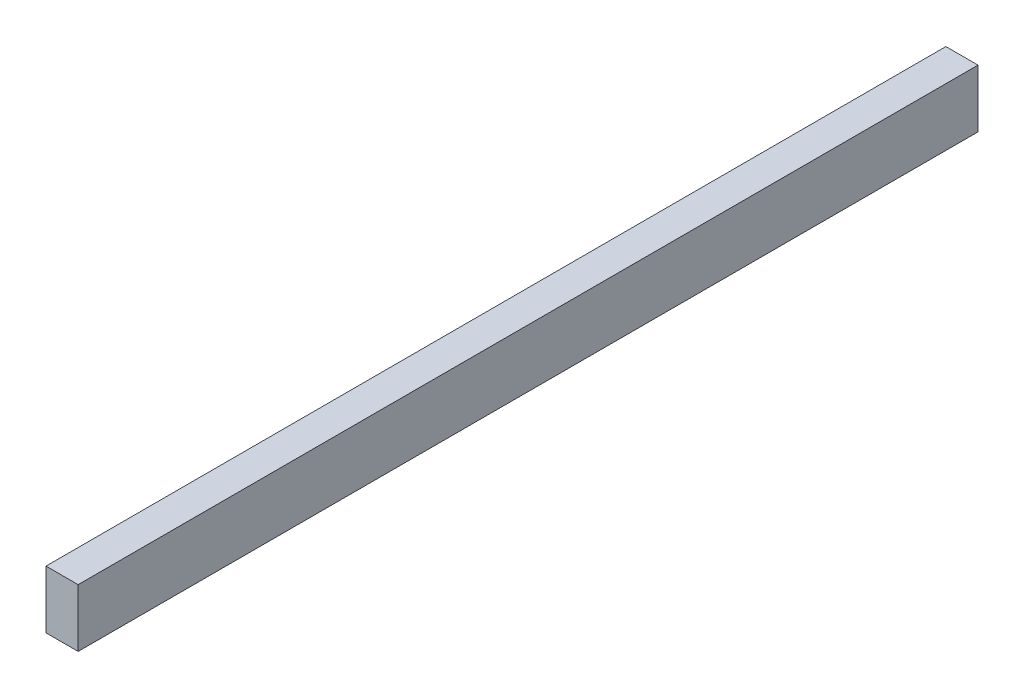
ISO-10303-21;
HEADER;
FILE_DESCRIPTION(('STEP AP214'),'2;1');
FILE_NAME('part.step','',(''),(''),'','','');
FILE_SCHEMA(('AUTOMOTIVE_DESIGN { 1 0 10303 214 1 1 1 1 }'));
ENDSEC;
DATA;
#1=APPLICATION_CONTEXT('core data for automotive mechanical design processes');
#2=APPLICATION_PROTOCOL_DEFINITION('international standard','automotive_design',2000,#1);
#3=PRODUCT_CONTEXT('',#1,'mechanical');
#4=PRODUCT('Part','Part','',(#3));
#5=PRODUCT_RELATED_PRODUCT_CATEGORY('part','',(#4));
#6=PRODUCT_DEFINITION_FORMATION('','',#4);
#7=PRODUCT_DEFINITION_CONTEXT('part definition',#1,'design');
#8=PRODUCT_DEFINITION('design','',#6,#7);
#9=PRODUCT_DEFINITION_SHAPE('','',#8);
#10=(LENGTH_UNIT() NAMED_UNIT(*) SI_UNIT(.MILLI.,.METRE.));
#11=(NAMED_UNIT(*) PLANE_ANGLE_UNIT() SI_UNIT($,.RADIAN.));
#12=(NAMED_UNIT(*) SI_UNIT($,.STERADIAN.) SOLID_ANGLE_UNIT());
#13=UNCERTAINTY_MEASURE_WITH_UNIT(LENGTH_MEASURE(1.E-05),#10,'distance_accuracy_value','');
#14=(GEOMETRIC_REPRESENTATION_CONTEXT(3) GLOBAL_UNCERTAINTY_ASSIGNED_CONTEXT((#13)) GLOBAL_UNIT_ASSIGNED_CONTEXT((#10,
#11,#12)) REPRESENTATION_CONTEXT('',''));
#15=CARTESIAN_POINT('',(0.,0.,0.));
#16=DIRECTION('',(0.,0.,1.));
#17=DIRECTION('',(1.,0.,0.));
#18=AXIS2_PLACEMENT_3D('',#15,#16,#17);
#19=CARTESIAN_POINT('',(0.,0.,700.));
#20=DIRECTION('',(1.,0.,0.));
#21=DIRECTION('',(0.,0.,-1.));
#22=AXIS2_PLACEMENT_3D('',#19,#20,#21);
#23=PLANE('',#22);
#24=DIRECTION('',(0.,-1.,0.));
#25=VECTOR('',#24,1.);
#26=CARTESIAN_POINT('',(0.,0.,0.));
#27=LINE('',#26,#25);
#28=CARTESIAN_POINT('',(0.,45.,0.));
#29=VERTEX_POINT('',#28);
#30=CARTESIAN_POINT('',(0.,0.,0.));
#31=VERTEX_POINT('',#30);
#32=EDGE_CURVE('E96',#29,#31,#27,.T.);
#33=ORIENTED_EDGE('',*,*,#32,.T.);
#34=DIRECTION('',(0.,0.,-1.));
#35=VECTOR('',#34,1.);
#36=CARTESIAN_POINT('',(0.,0.,700.));
#37=LINE('',#36,#35);
#38=CARTESIAN_POINT('',(0.,0.,700.));
#39=VERTEX_POINT('',#38);
#40=EDGE_CURVE('E11',#39,#31,#37,.T.);
#41=ORIENTED_EDGE('',*,*,#40,.F.);
#42=DIRECTION('',(0.,-1.,0.));
#43=VECTOR('',#42,1.);
#44=CARTESIAN_POINT('',(0.,0.,700.));
#45=LINE('',#44,#43);
#46=CARTESIAN_POINT('',(0.,45.,700.));
#47=VERTEX_POINT('',#46);
#48=EDGE_CURVE('E84',#47,#39,#45,.T.);
#49=ORIENTED_EDGE('',*,*,#48,.F.);
#50=DIRECTION('',(0.,0.,-1.));
#51=VECTOR('',#50,1.);
#52=CARTESIAN_POINT('',(0.,45.,700.));
#53=LINE('',#52,#51);
#54=EDGE_CURVE('E92',#47,#29,#53,.T.);
#55=ORIENTED_EDGE('',*,*,#54,.T.);
#56=EDGE_LOOP('',(#33,#41,#49,#55));
#57=FACE_BOUND('',#56,.T.);
#58=ADVANCED_FACE('F33',(#57),#23,.F.);
#59=CARTESIAN_POINT('',(0.,0.,700.));
#60=DIRECTION('',(0.,1.,0.));
#61=DIRECTION('',(0.,0.,1.));
#62=AXIS2_PLACEMENT_3D('',#59,#60,#61);
#63=PLANE('',#62);
#64=DIRECTION('',(1.,0.,0.));
#65=VECTOR('',#64,1.);
#66=CARTESIAN_POINT('',(0.,0.,0.));
#67=LINE('',#66,#65);
#68=CARTESIAN_POINT('',(25.,0.,0.));
#69=VERTEX_POINT('',#68);
#70=EDGE_CURVE('E88',#31,#69,#67,.T.);
#71=ORIENTED_EDGE('',*,*,#70,.T.);
#72=DIRECTION('',(0.,0.,-1.));
#73=VECTOR('',#72,1.);
#74=CARTESIAN_POINT('',(25.,0.,700.));
#75=LINE('',#74,#73);
#76=CARTESIAN_POINT('',(25.,0.,700.));
#77=VERTEX_POINT('',#76);
#78=EDGE_CURVE('E41',#77,#69,#75,.T.);
#79=ORIENTED_EDGE('',*,*,#78,.F.);
#80=DIRECTION('',(1.,0.,0.));
#81=VECTOR('',#80,1.);
#82=CARTESIAN_POINT('',(0.,0.,700.));
#83=LINE('',#82,#81);
#84=EDGE_CURVE('E79',#39,#77,#83,.T.);
#85=ORIENTED_EDGE('',*,*,#84,.F.);
#86=ORIENTED_EDGE('',*,*,#40,.T.);
#87=EDGE_LOOP('',(#71,#79,#85,#86));
#88=FACE_BOUND('',#87,.T.);
#89=ADVANCED_FACE('F87',(#88),#63,.F.);
#90=CARTESIAN_POINT('',(25.,0.,700.));
#91=DIRECTION('',(-1.,0.,0.));
#92=DIRECTION('',(0.,0.,1.));
#93=AXIS2_PLACEMENT_3D('',#90,#91,#92);
#94=PLANE('',#93);
#95=DIRECTION('',(0.,1.,0.));
#96=VECTOR('',#95,1.);
#97=CARTESIAN_POINT('',(25.,0.,0.));
#98=LINE('',#97,#96);
#99=CARTESIAN_POINT('',(25.,45.,0.));
#100=VERTEX_POINT('',#99);
#101=EDGE_CURVE('E66',#69,#100,#98,.T.);
#102=ORIENTED_EDGE('',*,*,#101,.T.);
#103=DIRECTION('',(0.,0.,-1.));
#104=VECTOR('',#103,1.);
#105=CARTESIAN_POINT('',(25.,45.,700.));
#106=LINE('',#105,#104);
#107=CARTESIAN_POINT('',(25.,45.,700.));
#108=VERTEX_POINT('',#107);
#109=EDGE_CURVE('E89',#108,#100,#106,.T.);
#110=ORIENTED_EDGE('',*,*,#109,.F.);
#111=DIRECTION('',(0.,1.,0.));
#112=VECTOR('',#111,1.);
#113=CARTESIAN_POINT('',(25.,0.,700.));
#114=LINE('',#113,#112);
#115=EDGE_CURVE('E82',#77,#108,#114,.T.);
#116=ORIENTED_EDGE('',*,*,#115,.F.);
#117=ORIENTED_EDGE('',*,*,#78,.T.);
#118=EDGE_LOOP('',(#102,#110,#116,#117));
#119=FACE_BOUND('',#118,.T.);
#120=ADVANCED_FACE('F90',(#119),#94,.F.);
#121=CARTESIAN_POINT('',(0.,45.,700.));
#122=DIRECTION('',(0.,-1.,0.));
#123=DIRECTION('',(0.,0.,-1.));
#124=AXIS2_PLACEMENT_3D('',#121,#122,#123);
#125=PLANE('',#124);
#126=DIRECTION('',(-1.,0.,0.));
#127=VECTOR('',#126,1.);
#128=CARTESIAN_POINT('',(0.,45.,0.));
#129=LINE('',#128,#127);
#130=EDGE_CURVE('E72',#100,#29,#129,.T.);
#131=ORIENTED_EDGE('',*,*,#130,.T.);
#132=ORIENTED_EDGE('',*,*,#54,.F.);
#133=DIRECTION('',(-1.,0.,0.));
#134=VECTOR('',#133,1.);
#135=CARTESIAN_POINT('',(0.,45.,700.));
#136=LINE('',#135,#134);
#137=EDGE_CURVE('E49',#108,#47,#136,.T.);
#138=ORIENTED_EDGE('',*,*,#137,.F.);
#139=ORIENTED_EDGE('',*,*,#109,.T.);
#140=EDGE_LOOP('',(#131,#132,#138,#139));
#141=FACE_BOUND('',#140,.T.);
#142=ADVANCED_FACE('F103',(#141),#125,.F.);
#143=CARTESIAN_POINT('',(0.,0.,700.));
#144=DIRECTION('',(0.,0.,-1.));
#145=DIRECTION('',(-1.,0.,0.));
#146=AXIS2_PLACEMENT_3D('',#143,#144,#145);
#147=PLANE('',#146);
#148=ORIENTED_EDGE('',*,*,#48,.T.);
#149=ORIENTED_EDGE('',*,*,#84,.T.);
#150=ORIENTED_EDGE('',*,*,#115,.T.);
#151=ORIENTED_EDGE('',*,*,#137,.T.);
#152=EDGE_LOOP('',(#148,#149,#150,#151));
#153=FACE_BOUND('',#152,.T.);
#154=ADVANCED_FACE('F80',(#153),#147,.F.);
#155=CARTESIAN_POINT('',(0.,0.,0.));
#156=DIRECTION('',(0.,0.,-1.));
#157=DIRECTION('',(-1.,0.,0.));
#158=AXIS2_PLACEMENT_3D('',#155,#156,#157);
#159=PLANE('',#158);
#160=ORIENTED_EDGE('',*,*,#32,.F.);
#161=ORIENTED_EDGE('',*,*,#130,.F.);
#162=ORIENTED_EDGE('',*,*,#101,.F.);
#163=ORIENTED_EDGE('',*,*,#70,.F.);
#164=EDGE_LOOP('',(#160,#161,#162,#163));
#165=FACE_BOUND('',#164,.T.);
#166=ADVANCED_FACE('F106',(#165),#159,.T.);
#167=CLOSED_SHELL('',(#58,#89,#120,#142,#154,#166));
#168=MANIFOLD_SOLID_BREP('B2',#167);
#169=ADVANCED_BREP_SHAPE_REPRESENTATION('',(#18,#168),#14);
#170=SHAPE_DEFINITION_REPRESENTATION(#9,#169);
ENDSEC;
END-ISO-10303-21;
